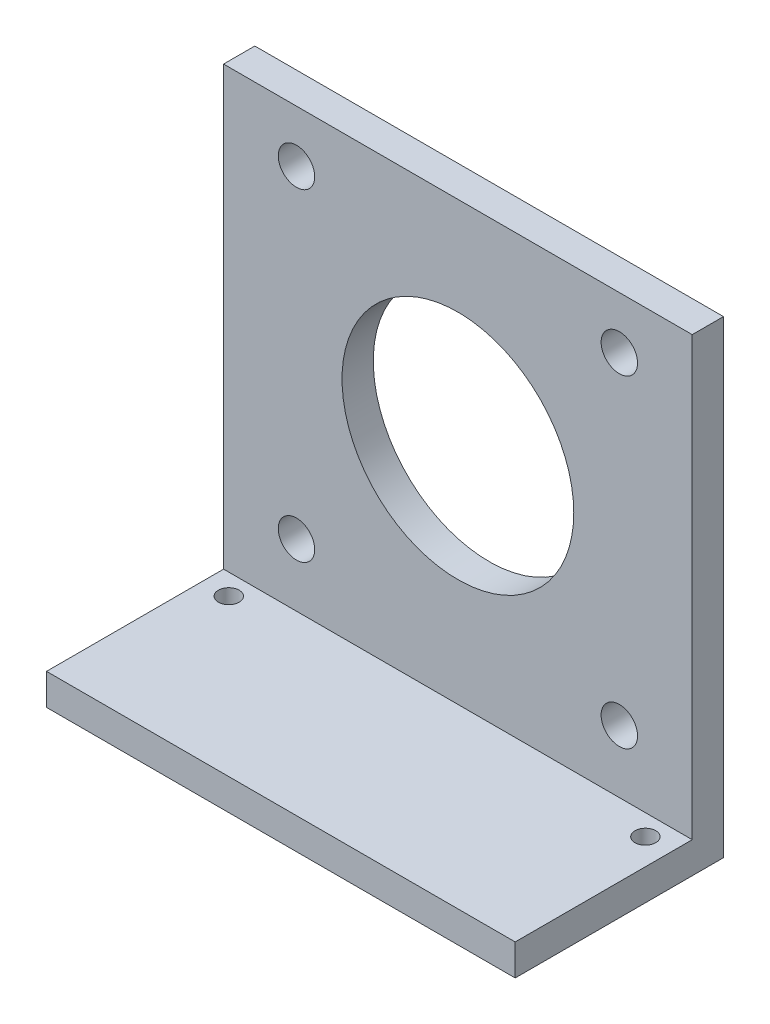
ISO-10303-21;
HEADER;
FILE_DESCRIPTION(('STEP AP214'),'2;1');
FILE_NAME('part.step','',(''),(''),'','','');
FILE_SCHEMA(('AUTOMOTIVE_DESIGN { 1 0 10303 214 1 1 1 1 }'));
ENDSEC;
DATA;
#1=APPLICATION_CONTEXT('core data for automotive mechanical design processes');
#2=APPLICATION_PROTOCOL_DEFINITION('international standard','automotive_design',2000,#1);
#3=PRODUCT_CONTEXT('',#1,'mechanical');
#4=PRODUCT('Part','Part','',(#3));
#5=PRODUCT_RELATED_PRODUCT_CATEGORY('part','',(#4));
#6=PRODUCT_DEFINITION_FORMATION('','',#4);
#7=PRODUCT_DEFINITION_CONTEXT('part definition',#1,'design');
#8=PRODUCT_DEFINITION('design','',#6,#7);
#9=PRODUCT_DEFINITION_SHAPE('','',#8);
#10=(LENGTH_UNIT() NAMED_UNIT(*) SI_UNIT(.MILLI.,.METRE.));
#11=(NAMED_UNIT(*) PLANE_ANGLE_UNIT() SI_UNIT($,.RADIAN.));
#12=(NAMED_UNIT(*) SI_UNIT($,.STERADIAN.) SOLID_ANGLE_UNIT());
#13=UNCERTAINTY_MEASURE_WITH_UNIT(LENGTH_MEASURE(1.E-05),#10,'distance_accuracy_value','');
#14=(GEOMETRIC_REPRESENTATION_CONTEXT(3) GLOBAL_UNCERTAINTY_ASSIGNED_CONTEXT((#13)) GLOBAL_UNIT_ASSIGNED_CONTEXT((#10,
#11,#12)) REPRESENTATION_CONTEXT('',''));
#15=CARTESIAN_POINT('',(0.,0.,0.));
#16=DIRECTION('',(0.,0.,1.));
#17=DIRECTION('',(1.,0.,0.));
#18=AXIS2_PLACEMENT_3D('',#15,#16,#17);
#19=CARTESIAN_POINT('',(0.,0.,3.));
#20=DIRECTION('',(0.,0.,1.));
#21=DIRECTION('',(1.,0.,0.));
#22=AXIS2_PLACEMENT_3D('',#19,#20,#21);
#23=PLANE('',#22);
#24=CARTESIAN_POINT('',(0.,0.,3.));
#25=DIRECTION('',(0.,0.,1.));
#26=DIRECTION('',(1.,0.,0.));
#27=AXIS2_PLACEMENT_3D('',#24,#25,#26);
#28=CIRCLE('',#27,1.75);
#29=CARTESIAN_POINT('',(1.75,0.,3.));
#30=VERTEX_POINT('',#29);
#31=EDGE_CURVE('E159',#30,#30,#28,.T.);
#32=ORIENTED_EDGE('',*,*,#31,.F.);
#33=EDGE_LOOP('',(#32));
#34=FACE_BOUND('',#33,.T.);
#35=CARTESIAN_POINT('',(31.,31.,3.));
#36=DIRECTION('',(0.,0.,1.));
#37=DIRECTION('',(1.,0.,0.));
#38=AXIS2_PLACEMENT_3D('',#35,#36,#37);
#39=CIRCLE('',#38,1.75000000000001);
#40=CARTESIAN_POINT('',(32.75,31.,3.));
#41=VERTEX_POINT('',#40);
#42=EDGE_CURVE('E171',#41,#41,#39,.T.);
#43=ORIENTED_EDGE('',*,*,#42,.F.);
#44=EDGE_LOOP('',(#43));
#45=FACE_BOUND('',#44,.T.);
#46=DIRECTION('',(0.,-1.,0.));
#47=VECTOR('',#46,1.);
#48=CARTESIAN_POINT('',(-7.,36.,3.));
#49=LINE('',#48,#47);
#50=CARTESIAN_POINT('',(-7.,36.,3.));
#51=VERTEX_POINT('',#50);
#52=CARTESIAN_POINT('',(-7.,-6.,3.));
#53=VERTEX_POINT('',#52);
#54=EDGE_CURVE('E98',#51,#53,#49,.T.);
#55=ORIENTED_EDGE('',*,*,#54,.T.);
#56=DIRECTION('',(1.,0.,0.));
#57=VECTOR('',#56,1.);
#58=CARTESIAN_POINT('',(-7.,-6.,3.));
#59=LINE('',#58,#57);
#60=CARTESIAN_POINT('',(38.,-6.,3.));
#61=VERTEX_POINT('',#60);
#62=EDGE_CURVE('E75',#53,#61,#59,.T.);
#63=ORIENTED_EDGE('',*,*,#62,.T.);
#64=DIRECTION('',(0.,1.,0.));
#65=VECTOR('',#64,1.);
#66=CARTESIAN_POINT('',(38.,36.,3.));
#67=LINE('',#66,#65);
#68=CARTESIAN_POINT('',(38.,36.,3.));
#69=VERTEX_POINT('',#68);
#70=EDGE_CURVE('E96',#61,#69,#67,.T.);
#71=ORIENTED_EDGE('',*,*,#70,.T.);
#72=DIRECTION('',(-1.,0.,0.));
#73=VECTOR('',#72,1.);
#74=CARTESIAN_POINT('',(-7.,36.,3.));
#75=LINE('',#74,#73);
#76=EDGE_CURVE('E54',#69,#51,#75,.T.);
#77=ORIENTED_EDGE('',*,*,#76,.T.);
#78=EDGE_LOOP('',(#55,#63,#71,#77));
#79=FACE_BOUND('',#78,.T.);
#80=CARTESIAN_POINT('',(0.,31.,3.));
#81=DIRECTION('',(0.,0.,1.));
#82=DIRECTION('',(1.,0.,0.));
#83=AXIS2_PLACEMENT_3D('',#80,#81,#82);
#84=CIRCLE('',#83,1.75);
#85=CARTESIAN_POINT('',(1.74999999999999,31.,3.));
#86=VERTEX_POINT('',#85);
#87=EDGE_CURVE('E108',#86,#86,#84,.T.);
#88=ORIENTED_EDGE('',*,*,#87,.F.);
#89=EDGE_LOOP('',(#88));
#90=FACE_BOUND('',#89,.T.);
#91=CARTESIAN_POINT('',(31.,0.,3.));
#92=DIRECTION('',(0.,0.,1.));
#93=DIRECTION('',(1.,0.,0.));
#94=AXIS2_PLACEMENT_3D('',#91,#92,#93);
#95=CIRCLE('',#94,1.75);
#96=CARTESIAN_POINT('',(32.75,0.,3.));
#97=VERTEX_POINT('',#96);
#98=EDGE_CURVE('E165',#97,#97,#95,.T.);
#99=ORIENTED_EDGE('',*,*,#98,.F.);
#100=EDGE_LOOP('',(#99));
#101=FACE_BOUND('',#100,.T.);
#102=CARTESIAN_POINT('',(15.5,15.5,3.));
#103=DIRECTION('',(0.,0.,1.));
#104=DIRECTION('',(1.,0.,0.));
#105=AXIS2_PLACEMENT_3D('',#102,#103,#104);
#106=CIRCLE('',#105,11.125);
#107=CARTESIAN_POINT('',(26.625,15.5,3.));
#108=VERTEX_POINT('',#107);
#109=EDGE_CURVE('E153',#108,#108,#106,.T.);
#110=ORIENTED_EDGE('',*,*,#109,.F.);
#111=EDGE_LOOP('',(#110));
#112=FACE_BOUND('',#111,.T.);
#113=ADVANCED_FACE('F37',(#34,#45,#79,#90,#101,#112),#23,.T.);
#114=CARTESIAN_POINT('',(0.,0.,0.));
#115=DIRECTION('',(0.,0.,1.));
#116=DIRECTION('',(1.,0.,0.));
#117=AXIS2_PLACEMENT_3D('',#114,#115,#116);
#118=PLANE('',#117);
#119=DIRECTION('',(0.,-1.,0.));
#120=VECTOR('',#119,1.);
#121=CARTESIAN_POINT('',(-7.,36.,0.));
#122=LINE('',#121,#120);
#123=CARTESIAN_POINT('',(-7.,36.,0.));
#124=VERTEX_POINT('',#123);
#125=CARTESIAN_POINT('',(-7.,-9.,0.));
#126=VERTEX_POINT('',#125);
#127=EDGE_CURVE('E105',#124,#126,#122,.T.);
#128=ORIENTED_EDGE('',*,*,#127,.F.);
#129=DIRECTION('',(-1.,0.,0.));
#130=VECTOR('',#129,1.);
#131=CARTESIAN_POINT('',(-7.,36.,0.));
#132=LINE('',#131,#130);
#133=CARTESIAN_POINT('',(38.,36.,0.));
#134=VERTEX_POINT('',#133);
#135=EDGE_CURVE('E110',#134,#124,#132,.T.);
#136=ORIENTED_EDGE('',*,*,#135,.F.);
#137=DIRECTION('',(0.,1.,0.));
#138=VECTOR('',#137,1.);
#139=CARTESIAN_POINT('',(38.,36.,0.));
#140=LINE('',#139,#138);
#141=CARTESIAN_POINT('',(38.,-9.,0.));
#142=VERTEX_POINT('',#141);
#143=EDGE_CURVE('E66',#142,#134,#140,.T.);
#144=ORIENTED_EDGE('',*,*,#143,.F.);
#145=DIRECTION('',(1.,0.,0.));
#146=VECTOR('',#145,1.);
#147=CARTESIAN_POINT('',(-7.,-9.,0.));
#148=LINE('',#147,#146);
#149=EDGE_CURVE('E123',#126,#142,#148,.T.);
#150=ORIENTED_EDGE('',*,*,#149,.F.);
#151=EDGE_LOOP('',(#128,#136,#144,#150));
#152=FACE_BOUND('',#151,.T.);
#153=CARTESIAN_POINT('',(0.,31.,0.));
#154=DIRECTION('',(0.,0.,1.));
#155=DIRECTION('',(1.,0.,0.));
#156=AXIS2_PLACEMENT_3D('',#153,#154,#155);
#157=CIRCLE('',#156,1.75);
#158=CARTESIAN_POINT('',(1.74999999999999,31.,0.));
#159=VERTEX_POINT('',#158);
#160=EDGE_CURVE('E174',#159,#159,#157,.T.);
#161=ORIENTED_EDGE('',*,*,#160,.T.);
#162=EDGE_LOOP('',(#161));
#163=FACE_BOUND('',#162,.T.);
#164=CARTESIAN_POINT('',(31.,31.,0.));
#165=DIRECTION('',(0.,0.,1.));
#166=DIRECTION('',(1.,0.,0.));
#167=AXIS2_PLACEMENT_3D('',#164,#165,#166);
#168=CIRCLE('',#167,1.75000000000001);
#169=CARTESIAN_POINT('',(32.75,31.,0.));
#170=VERTEX_POINT('',#169);
#171=EDGE_CURVE('E168',#170,#170,#168,.T.);
#172=ORIENTED_EDGE('',*,*,#171,.T.);
#173=EDGE_LOOP('',(#172));
#174=FACE_BOUND('',#173,.T.);
#175=CARTESIAN_POINT('',(31.,0.,0.));
#176=DIRECTION('',(0.,0.,1.));
#177=DIRECTION('',(1.,0.,0.));
#178=AXIS2_PLACEMENT_3D('',#175,#176,#177);
#179=CIRCLE('',#178,1.75);
#180=CARTESIAN_POINT('',(32.75,0.,0.));
#181=VERTEX_POINT('',#180);
#182=EDGE_CURVE('E162',#181,#181,#179,.T.);
#183=ORIENTED_EDGE('',*,*,#182,.T.);
#184=EDGE_LOOP('',(#183));
#185=FACE_BOUND('',#184,.T.);
#186=CARTESIAN_POINT('',(0.,0.,0.));
#187=DIRECTION('',(0.,0.,1.));
#188=DIRECTION('',(1.,0.,0.));
#189=AXIS2_PLACEMENT_3D('',#186,#187,#188);
#190=CIRCLE('',#189,1.75);
#191=CARTESIAN_POINT('',(1.75,0.,0.));
#192=VERTEX_POINT('',#191);
#193=EDGE_CURVE('E156',#192,#192,#190,.T.);
#194=ORIENTED_EDGE('',*,*,#193,.T.);
#195=EDGE_LOOP('',(#194));
#196=FACE_BOUND('',#195,.T.);
#197=CARTESIAN_POINT('',(15.5,15.5,0.));
#198=DIRECTION('',(0.,0.,1.));
#199=DIRECTION('',(1.,0.,0.));
#200=AXIS2_PLACEMENT_3D('',#197,#198,#199);
#201=CIRCLE('',#200,11.125);
#202=CARTESIAN_POINT('',(26.625,15.5,0.));
#203=VERTEX_POINT('',#202);
#204=EDGE_CURVE('E152',#203,#203,#201,.T.);
#205=ORIENTED_EDGE('',*,*,#204,.T.);
#206=EDGE_LOOP('',(#205));
#207=FACE_BOUND('',#206,.T.);
#208=ADVANCED_FACE('F120',(#152,#163,#174,#185,#196,#207),#118,.F.);
#209=CARTESIAN_POINT('',(-7.,36.,3.));
#210=DIRECTION('',(1.,0.,0.));
#211=DIRECTION('',(0.,1.,0.));
#212=AXIS2_PLACEMENT_3D('',#209,#210,#211);
#213=PLANE('',#212);
#214=ORIENTED_EDGE('',*,*,#127,.T.);
#215=DIRECTION('',(0.,0.,-1.));
#216=VECTOR('',#215,1.);
#217=CARTESIAN_POINT('',(-7.,-9.,0.));
#218=LINE('',#217,#216);
#219=CARTESIAN_POINT('',(-7.,-9.,20.));
#220=VERTEX_POINT('',#219);
#221=EDGE_CURVE('E130',#220,#126,#218,.T.);
#222=ORIENTED_EDGE('',*,*,#221,.F.);
#223=DIRECTION('',(0.,1.,0.));
#224=VECTOR('',#223,1.);
#225=CARTESIAN_POINT('',(-7.,-9.,20.));
#226=LINE('',#225,#224);
#227=CARTESIAN_POINT('',(-7.,-6.,20.));
#228=VERTEX_POINT('',#227);
#229=EDGE_CURVE('E146',#220,#228,#226,.T.);
#230=ORIENTED_EDGE('',*,*,#229,.T.);
#231=DIRECTION('',(0.,0.,-1.));
#232=VECTOR('',#231,1.);
#233=CARTESIAN_POINT('',(-7.,-6.,0.));
#234=LINE('',#233,#232);
#235=EDGE_CURVE('E93',#228,#53,#234,.T.);
#236=ORIENTED_EDGE('',*,*,#235,.T.);
#237=ORIENTED_EDGE('',*,*,#54,.F.);
#238=DIRECTION('',(0.,0.,-1.));
#239=VECTOR('',#238,1.);
#240=CARTESIAN_POINT('',(-7.,36.,3.));
#241=LINE('',#240,#239);
#242=EDGE_CURVE('E46',#51,#124,#241,.T.);
#243=ORIENTED_EDGE('',*,*,#242,.T.);
#244=EDGE_LOOP('',(#214,#222,#230,#236,#237,#243));
#245=FACE_BOUND('',#244,.T.);
#246=ADVANCED_FACE('F39',(#245),#213,.F.);
#247=CARTESIAN_POINT('',(38.,36.,3.));
#248=DIRECTION('',(-1.,0.,0.));
#249=DIRECTION('',(0.,0.,1.));
#250=AXIS2_PLACEMENT_3D('',#247,#248,#249);
#251=PLANE('',#250);
#252=ORIENTED_EDGE('',*,*,#143,.T.);
#253=DIRECTION('',(0.,0.,-1.));
#254=VECTOR('',#253,1.);
#255=CARTESIAN_POINT('',(38.,36.,3.));
#256=LINE('',#255,#254);
#257=EDGE_CURVE('E11',#69,#134,#256,.T.);
#258=ORIENTED_EDGE('',*,*,#257,.F.);
#259=ORIENTED_EDGE('',*,*,#70,.F.);
#260=DIRECTION('',(0.,0.,1.));
#261=VECTOR('',#260,1.);
#262=CARTESIAN_POINT('',(38.,-6.,0.));
#263=LINE('',#262,#261);
#264=CARTESIAN_POINT('',(38.,-6.,20.));
#265=VERTEX_POINT('',#264);
#266=EDGE_CURVE('E85',#61,#265,#263,.T.);
#267=ORIENTED_EDGE('',*,*,#266,.T.);
#268=DIRECTION('',(0.,1.,0.));
#269=VECTOR('',#268,1.);
#270=CARTESIAN_POINT('',(38.,-9.,20.));
#271=LINE('',#270,#269);
#272=CARTESIAN_POINT('',(38.,-9.,20.));
#273=VERTEX_POINT('',#272);
#274=EDGE_CURVE('E150',#273,#265,#271,.T.);
#275=ORIENTED_EDGE('',*,*,#274,.F.);
#276=DIRECTION('',(0.,0.,1.));
#277=VECTOR('',#276,1.);
#278=CARTESIAN_POINT('',(38.,-9.,0.));
#279=LINE('',#278,#277);
#280=EDGE_CURVE('E129',#142,#273,#279,.T.);
#281=ORIENTED_EDGE('',*,*,#280,.F.);
#282=EDGE_LOOP('',(#252,#258,#259,#267,#275,#281));
#283=FACE_BOUND('',#282,.T.);
#284=ADVANCED_FACE('F100',(#283),#251,.F.);
#285=CARTESIAN_POINT('',(-7.,36.,3.));
#286=DIRECTION('',(0.,-1.,0.));
#287=DIRECTION('',(0.,0.,-1.));
#288=AXIS2_PLACEMENT_3D('',#285,#286,#287);
#289=PLANE('',#288);
#290=ORIENTED_EDGE('',*,*,#135,.T.);
#291=ORIENTED_EDGE('',*,*,#242,.F.);
#292=ORIENTED_EDGE('',*,*,#76,.F.);
#293=ORIENTED_EDGE('',*,*,#257,.T.);
#294=EDGE_LOOP('',(#290,#291,#292,#293));
#295=FACE_BOUND('',#294,.T.);
#296=ADVANCED_FACE('F186',(#295),#289,.F.);
#297=CARTESIAN_POINT('',(0.,31.,3.));
#298=DIRECTION('',(0.,0.,-1.));
#299=DIRECTION('',(-1.,0.,0.));
#300=AXIS2_PLACEMENT_3D('',#297,#298,#299);
#301=CYLINDRICAL_SURFACE('',#300,1.75);
#302=ORIENTED_EDGE('',*,*,#87,.T.);
#303=EDGE_LOOP('',(#302));
#304=FACE_BOUND('',#303,.T.);
#305=ORIENTED_EDGE('',*,*,#160,.F.);
#306=EDGE_LOOP('',(#305));
#307=FACE_BOUND('',#306,.T.);
#308=ADVANCED_FACE('F183',(#304,#307),#301,.F.);
#309=CARTESIAN_POINT('',(31.,31.,3.));
#310=DIRECTION('',(0.,0.,-1.));
#311=DIRECTION('',(-1.,0.,0.));
#312=AXIS2_PLACEMENT_3D('',#309,#310,#311);
#313=CYLINDRICAL_SURFACE('',#312,1.75000000000001);
#314=ORIENTED_EDGE('',*,*,#42,.T.);
#315=EDGE_LOOP('',(#314));
#316=FACE_BOUND('',#315,.T.);
#317=ORIENTED_EDGE('',*,*,#171,.F.);
#318=EDGE_LOOP('',(#317));
#319=FACE_BOUND('',#318,.T.);
#320=ADVANCED_FACE('F185',(#316,#319),#313,.F.);
#321=CARTESIAN_POINT('',(31.,0.,3.));
#322=DIRECTION('',(0.,0.,-1.));
#323=DIRECTION('',(-1.,0.,0.));
#324=AXIS2_PLACEMENT_3D('',#321,#322,#323);
#325=CYLINDRICAL_SURFACE('',#324,1.75);
#326=ORIENTED_EDGE('',*,*,#98,.T.);
#327=EDGE_LOOP('',(#326));
#328=FACE_BOUND('',#327,.T.);
#329=ORIENTED_EDGE('',*,*,#182,.F.);
#330=EDGE_LOOP('',(#329));
#331=FACE_BOUND('',#330,.T.);
#332=ADVANCED_FACE('F193',(#328,#331),#325,.F.);
#333=CARTESIAN_POINT('',(0.,0.,3.));
#334=DIRECTION('',(0.,0.,-1.));
#335=DIRECTION('',(-1.,0.,0.));
#336=AXIS2_PLACEMENT_3D('',#333,#334,#335);
#337=CYLINDRICAL_SURFACE('',#336,1.75);
#338=ORIENTED_EDGE('',*,*,#31,.T.);
#339=EDGE_LOOP('',(#338));
#340=FACE_BOUND('',#339,.T.);
#341=ORIENTED_EDGE('',*,*,#193,.F.);
#342=EDGE_LOOP('',(#341));
#343=FACE_BOUND('',#342,.T.);
#344=ADVANCED_FACE('F232',(#340,#343),#337,.F.);
#345=CARTESIAN_POINT('',(15.5,15.5,3.));
#346=DIRECTION('',(0.,0.,-1.));
#347=DIRECTION('',(-1.,0.,0.));
#348=AXIS2_PLACEMENT_3D('',#345,#346,#347);
#349=CYLINDRICAL_SURFACE('',#348,11.125);
#350=ORIENTED_EDGE('',*,*,#109,.T.);
#351=EDGE_LOOP('',(#350));
#352=FACE_BOUND('',#351,.T.);
#353=ORIENTED_EDGE('',*,*,#204,.F.);
#354=EDGE_LOOP('',(#353));
#355=FACE_BOUND('',#354,.T.);
#356=ADVANCED_FACE('F228',(#352,#355),#349,.F.);
#357=CARTESIAN_POINT('',(0.,-6.,0.));
#358=DIRECTION('',(0.,1.,0.));
#359=DIRECTION('',(-1.,0.,0.));
#360=AXIS2_PLACEMENT_3D('',#357,#358,#359);
#361=PLANE('',#360);
#362=CARTESIAN_POINT('',(35.5,-6.,5.00000000000001));
#363=DIRECTION('',(0.,-1.,0.));
#364=DIRECTION('',(-1.,0.,0.));
#365=AXIS2_PLACEMENT_3D('',#362,#363,#364);
#366=CIRCLE('',#365,0.999999999999998);
#367=CARTESIAN_POINT('',(34.5,-6.,5.00000000000001));
#368=VERTEX_POINT('',#367);
#369=EDGE_CURVE('E362',#368,#368,#366,.T.);
#370=ORIENTED_EDGE('',*,*,#369,.T.);
#371=EDGE_LOOP('',(#370));
#372=FACE_BOUND('',#371,.T.);
#373=CARTESIAN_POINT('',(-4.50000000000001,-6.,5.));
#374=DIRECTION('',(0.,-1.,0.));
#375=DIRECTION('',(1.,0.,0.));
#376=AXIS2_PLACEMENT_3D('',#373,#374,#375);
#377=CIRCLE('',#376,1.);
#378=CARTESIAN_POINT('',(-3.5,-6.,5.));
#379=VERTEX_POINT('',#378);
#380=EDGE_CURVE('E141',#379,#379,#377,.T.);
#381=ORIENTED_EDGE('',*,*,#380,.T.);
#382=EDGE_LOOP('',(#381));
#383=FACE_BOUND('',#382,.T.);
#384=ORIENTED_EDGE('',*,*,#62,.F.);
#385=ORIENTED_EDGE('',*,*,#235,.F.);
#386=DIRECTION('',(-1.,0.,0.));
#387=VECTOR('',#386,1.);
#388=CARTESIAN_POINT('',(-7.,-6.,20.));
#389=LINE('',#388,#387);
#390=EDGE_CURVE('E89',#265,#228,#389,.T.);
#391=ORIENTED_EDGE('',*,*,#390,.F.);
#392=ORIENTED_EDGE('',*,*,#266,.F.);
#393=EDGE_LOOP('',(#384,#385,#391,#392));
#394=FACE_BOUND('',#393,.T.);
#395=ADVANCED_FACE('F86',(#372,#383,#394),#361,.T.);
#396=CARTESIAN_POINT('',(0.,-9.,0.));
#397=DIRECTION('',(0.,1.,0.));
#398=DIRECTION('',(-1.,0.,0.));
#399=AXIS2_PLACEMENT_3D('',#396,#397,#398);
#400=PLANE('',#399);
#401=ORIENTED_EDGE('',*,*,#221,.T.);
#402=ORIENTED_EDGE('',*,*,#149,.T.);
#403=ORIENTED_EDGE('',*,*,#280,.T.);
#404=DIRECTION('',(-1.,0.,0.));
#405=VECTOR('',#404,1.);
#406=CARTESIAN_POINT('',(-7.,-9.,20.));
#407=LINE('',#406,#405);
#408=EDGE_CURVE('E135',#273,#220,#407,.T.);
#409=ORIENTED_EDGE('',*,*,#408,.T.);
#410=EDGE_LOOP('',(#401,#402,#403,#409));
#411=FACE_BOUND('',#410,.T.);
#412=CARTESIAN_POINT('',(-4.50000000000001,-9.,5.));
#413=DIRECTION('',(0.,-1.,0.));
#414=DIRECTION('',(1.,0.,0.));
#415=AXIS2_PLACEMENT_3D('',#412,#413,#414);
#416=CIRCLE('',#415,1.);
#417=CARTESIAN_POINT('',(-3.5,-9.,5.));
#418=VERTEX_POINT('',#417);
#419=EDGE_CURVE('E147',#418,#418,#416,.T.);
#420=ORIENTED_EDGE('',*,*,#419,.F.);
#421=EDGE_LOOP('',(#420));
#422=FACE_BOUND('',#421,.T.);
#423=CARTESIAN_POINT('',(35.5,-9.,5.00000000000001));
#424=DIRECTION('',(0.,-1.,0.));
#425=DIRECTION('',(-1.,0.,0.));
#426=AXIS2_PLACEMENT_3D('',#423,#424,#425);
#427=CIRCLE('',#426,0.999999999999998);
#428=CARTESIAN_POINT('',(34.5,-9.,5.00000000000001));
#429=VERTEX_POINT('',#428);
#430=EDGE_CURVE('E359',#429,#429,#427,.T.);
#431=ORIENTED_EDGE('',*,*,#430,.F.);
#432=EDGE_LOOP('',(#431));
#433=FACE_BOUND('',#432,.T.);
#434=ADVANCED_FACE('F132',(#411,#422,#433),#400,.F.);
#435=CARTESIAN_POINT('',(-7.,-9.,20.));
#436=DIRECTION('',(0.,0.,-1.));
#437=DIRECTION('',(-1.,0.,0.));
#438=AXIS2_PLACEMENT_3D('',#435,#436,#437);
#439=PLANE('',#438);
#440=ORIENTED_EDGE('',*,*,#390,.T.);
#441=ORIENTED_EDGE('',*,*,#229,.F.);
#442=ORIENTED_EDGE('',*,*,#408,.F.);
#443=ORIENTED_EDGE('',*,*,#274,.T.);
#444=EDGE_LOOP('',(#440,#441,#442,#443));
#445=FACE_BOUND('',#444,.T.);
#446=ADVANCED_FACE('F316',(#445),#439,.F.);
#447=CARTESIAN_POINT('',(-4.50000000000001,-9.,5.));
#448=DIRECTION('',(0.,1.,0.));
#449=DIRECTION('',(-1.,0.,0.));
#450=AXIS2_PLACEMENT_3D('',#447,#448,#449);
#451=CYLINDRICAL_SURFACE('',#450,1.);
#452=ORIENTED_EDGE('',*,*,#419,.T.);
#453=EDGE_LOOP('',(#452));
#454=FACE_BOUND('',#453,.T.);
#455=ORIENTED_EDGE('',*,*,#380,.F.);
#456=EDGE_LOOP('',(#455));
#457=FACE_BOUND('',#456,.T.);
#458=ADVANCED_FACE('F326',(#454,#457),#451,.F.);
#459=CARTESIAN_POINT('',(35.5,-9.,5.00000000000001));
#460=DIRECTION('',(0.,1.,0.));
#461=DIRECTION('',(-1.,0.,0.));
#462=AXIS2_PLACEMENT_3D('',#459,#460,#461);
#463=CYLINDRICAL_SURFACE('',#462,0.999999999999998);
#464=ORIENTED_EDGE('',*,*,#430,.T.);
#465=EDGE_LOOP('',(#464));
#466=FACE_BOUND('',#465,.T.);
#467=ORIENTED_EDGE('',*,*,#369,.F.);
#468=EDGE_LOOP('',(#467));
#469=FACE_BOUND('',#468,.T.);
#470=ADVANCED_FACE('F337',(#466,#469),#463,.F.);
#471=CLOSED_SHELL('',(#113,#208,#246,#284,#296,#308,#320,#332,#344,#356,#395,#434,#446,#458,#470));
#472=MANIFOLD_SOLID_BREP('B2',#471);
#473=ADVANCED_BREP_SHAPE_REPRESENTATION('',(#18,#472),#14);
#474=SHAPE_DEFINITION_REPRESENTATION(#9,#473);
ENDSEC;
END-ISO-10303-21;
